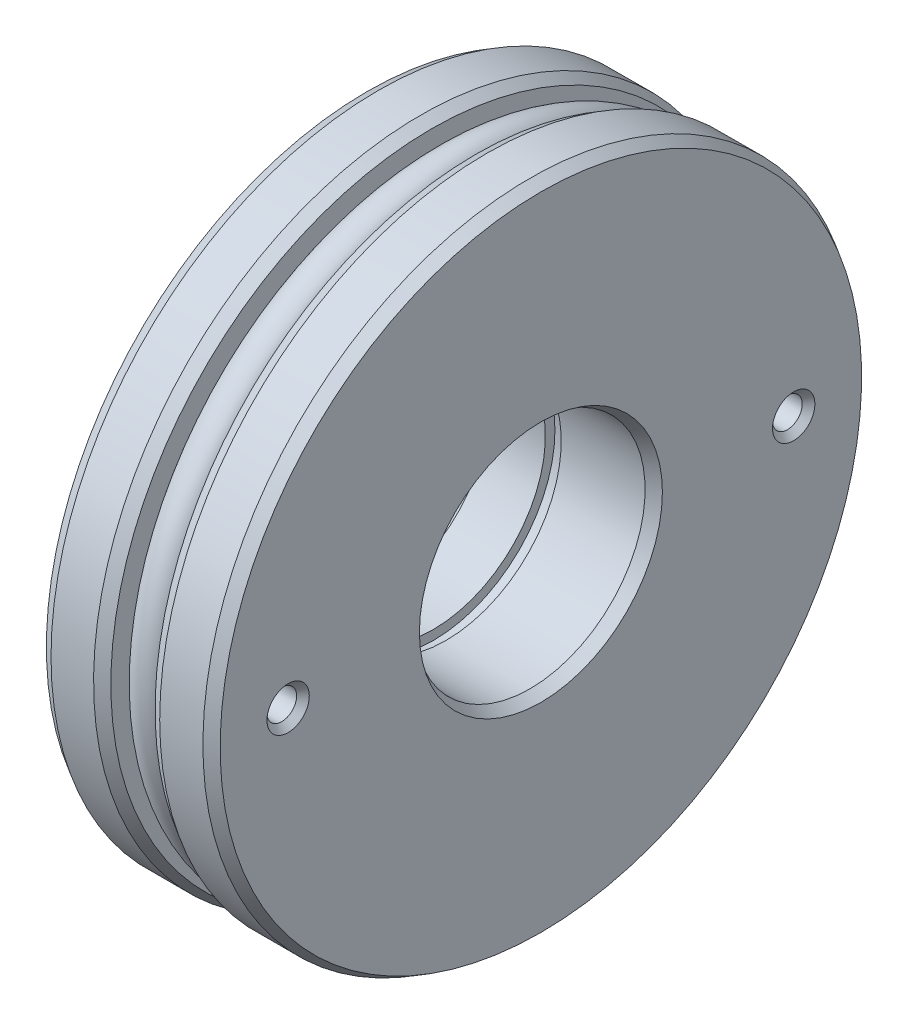
ISO-10303-21;
HEADER;
FILE_DESCRIPTION(('STEP AP214'),'2;1');
FILE_NAME('part.step','',(''),(''),'','','');
FILE_SCHEMA(('AUTOMOTIVE_DESIGN { 1 0 10303 214 1 1 1 1 }'));
ENDSEC;
DATA;
#1=APPLICATION_CONTEXT('core data for automotive mechanical design processes');
#2=APPLICATION_PROTOCOL_DEFINITION('international standard','automotive_design',2000,#1);
#3=PRODUCT_CONTEXT('',#1,'mechanical');
#4=PRODUCT('Part','Part','',(#3));
#5=PRODUCT_RELATED_PRODUCT_CATEGORY('part','',(#4));
#6=PRODUCT_DEFINITION_FORMATION('','',#4);
#7=PRODUCT_DEFINITION_CONTEXT('part definition',#1,'design');
#8=PRODUCT_DEFINITION('design','',#6,#7);
#9=PRODUCT_DEFINITION_SHAPE('','',#8);
#10=(LENGTH_UNIT() NAMED_UNIT(*) SI_UNIT(.MILLI.,.METRE.));
#11=(NAMED_UNIT(*) PLANE_ANGLE_UNIT() SI_UNIT($,.RADIAN.));
#12=(NAMED_UNIT(*) SI_UNIT($,.STERADIAN.) SOLID_ANGLE_UNIT());
#13=UNCERTAINTY_MEASURE_WITH_UNIT(LENGTH_MEASURE(1.E-05),#10,'distance_accuracy_value','');
#14=(GEOMETRIC_REPRESENTATION_CONTEXT(3) GLOBAL_UNCERTAINTY_ASSIGNED_CONTEXT((#13)) GLOBAL_UNIT_ASSIGNED_CONTEXT((#10,
#11,#12)) REPRESENTATION_CONTEXT('',''));
#15=CARTESIAN_POINT('',(0.,0.,0.));
#16=DIRECTION('',(0.,0.,1.));
#17=DIRECTION('',(1.,0.,0.));
#18=AXIS2_PLACEMENT_3D('',#15,#16,#17);
#19=CARTESIAN_POINT('',(3.4925,4.62915,0.));
#20=DIRECTION('',(-1.,0.,0.));
#21=DIRECTION('',(0.,-1.,0.));
#22=AXIS2_PLACEMENT_3D('',#19,#20,#21);
#23=PLANE('',#22);
#24=CARTESIAN_POINT('',(3.4925,0.,-10.16));
#25=DIRECTION('',(-1.,0.,0.));
#26=DIRECTION('',(0.,-1.,0.));
#27=AXIS2_PLACEMENT_3D('',#24,#25,#26);
#28=CIRCLE('',#27,0.850900000000013);
#29=CARTESIAN_POINT('',(3.4925,-0.850900000000013,-10.16));
#30=VERTEX_POINT('',#29);
#31=EDGE_CURVE('P0_E43',#30,#30,#28,.T.);
#32=ORIENTED_EDGE('',*,*,#31,.T.);
#33=EDGE_LOOP('',(#32));
#34=FACE_BOUND('',#33,.T.);
#35=CARTESIAN_POINT('',(3.4925,0.,10.16));
#36=DIRECTION('',(-1.,0.,0.));
#37=DIRECTION('',(0.,-1.,0.));
#38=AXIS2_PLACEMENT_3D('',#35,#36,#37);
#39=CIRCLE('',#38,0.850900000000013);
#40=CARTESIAN_POINT('',(3.4925,-0.850900000000013,10.16));
#41=VERTEX_POINT('',#40);
#42=EDGE_CURVE('P0_E46',#41,#41,#39,.T.);
#43=ORIENTED_EDGE('',*,*,#42,.T.);
#44=EDGE_LOOP('',(#43));
#45=FACE_BOUND('',#44,.T.);
#46=CARTESIAN_POINT('',(3.4925,0.,0.));
#47=DIRECTION('',(-1.,0.,0.));
#48=DIRECTION('',(0.,-1.,0.));
#49=AXIS2_PLACEMENT_3D('',#46,#47,#48);
#50=CIRCLE('',#49,4.88315);
#51=CARTESIAN_POINT('',(3.4925,-4.88315,0.));
#52=VERTEX_POINT('',#51);
#53=EDGE_CURVE('P0_E70',#52,#52,#50,.T.);
#54=ORIENTED_EDGE('',*,*,#53,.T.);
#55=EDGE_LOOP('',(#54));
#56=FACE_BOUND('',#55,.T.);
#57=CARTESIAN_POINT('',(3.4925,0.,0.));
#58=DIRECTION('',(-1.,0.,0.));
#59=DIRECTION('',(0.,-1.,0.));
#60=AXIS2_PLACEMENT_3D('',#57,#58,#59);
#61=CIRCLE('',#60,12.8905);
#62=CARTESIAN_POINT('',(3.4925,-12.8905,0.));
#63=VERTEX_POINT('',#62);
#64=EDGE_CURVE('P0_E73',#63,#63,#61,.F.);
#65=ORIENTED_EDGE('',*,*,#64,.T.);
#66=EDGE_LOOP('',(#65));
#67=FACE_BOUND('',#66,.T.);
#68=ADVANCED_FACE('P0_F17',(#34,#45,#56,#67),#23,.F.);
#69=CARTESIAN_POINT('',(-3.4925,13.1445,0.));
#70=DIRECTION('',(1.,0.,0.));
#71=DIRECTION('',(0.,1.,0.));
#72=AXIS2_PLACEMENT_3D('',#69,#70,#71);
#73=PLANE('',#72);
#74=CARTESIAN_POINT('',(-3.4925,0.,10.16));
#75=DIRECTION('',(1.,0.,0.));
#76=DIRECTION('',(0.,1.,0.));
#77=AXIS2_PLACEMENT_3D('',#74,#75,#76);
#78=CIRCLE('',#77,0.850900000000009);
#79=CARTESIAN_POINT('',(-3.4925,0.850900000000008,10.16));
#80=VERTEX_POINT('',#79);
#81=EDGE_CURVE('P0_E24',#80,#80,#78,.T.);
#82=ORIENTED_EDGE('',*,*,#81,.T.);
#83=EDGE_LOOP('',(#82));
#84=FACE_BOUND('',#83,.T.);
#85=CARTESIAN_POINT('',(-3.4925,0.,-10.16));
#86=DIRECTION('',(1.,0.,0.));
#87=DIRECTION('',(0.,1.,0.));
#88=AXIS2_PLACEMENT_3D('',#85,#86,#87);
#89=CIRCLE('',#88,0.850900000000009);
#90=CARTESIAN_POINT('',(-3.4925,0.850900000000008,-10.16));
#91=VERTEX_POINT('',#90);
#92=EDGE_CURVE('P0_E28',#91,#91,#89,.T.);
#93=ORIENTED_EDGE('',*,*,#92,.T.);
#94=EDGE_LOOP('',(#93));
#95=FACE_BOUND('',#94,.T.);
#96=CARTESIAN_POINT('',(-3.4925,0.,0.));
#97=DIRECTION('',(1.,0.,0.));
#98=DIRECTION('',(0.,1.,0.));
#99=AXIS2_PLACEMENT_3D('',#96,#97,#98);
#100=CIRCLE('',#99,4.75400000000001);
#101=CARTESIAN_POINT('',(-3.4925,4.75400000000001,0.));
#102=VERTEX_POINT('',#101);
#103=EDGE_CURVE('P0_E58',#102,#102,#100,.T.);
#104=ORIENTED_EDGE('',*,*,#103,.T.);
#105=EDGE_LOOP('',(#104));
#106=FACE_BOUND('',#105,.T.);
#107=CARTESIAN_POINT('',(-3.4925,0.,0.));
#108=DIRECTION('',(1.,0.,0.));
#109=DIRECTION('',(0.,1.,0.));
#110=AXIS2_PLACEMENT_3D('',#107,#108,#109);
#111=CIRCLE('',#110,12.8905);
#112=CARTESIAN_POINT('',(-3.4925,12.8905,0.));
#113=VERTEX_POINT('',#112);
#114=EDGE_CURVE('P0_E61',#113,#113,#111,.F.);
#115=ORIENTED_EDGE('',*,*,#114,.T.);
#116=EDGE_LOOP('',(#115));
#117=FACE_BOUND('',#116,.T.);
#118=ADVANCED_FACE('P0_F135',(#84,#95,#106,#117),#73,.F.);
#119=CARTESIAN_POINT('',(-3.4925,0.,0.));
#120=DIRECTION('',(-1.,0.,0.));
#121=DIRECTION('',(0.,-1.,0.));
#122=AXIS2_PLACEMENT_3D('',#119,#120,#121);
#123=CYLINDRICAL_SURFACE('',#122,4.5);
#124=CARTESIAN_POINT('',(-3.05255909487748,0.,0.));
#125=DIRECTION('',(1.,0.,0.));
#126=DIRECTION('',(0.,1.,0.));
#127=AXIS2_PLACEMENT_3D('',#124,#125,#126);
#128=CIRCLE('',#127,4.5);
#129=CARTESIAN_POINT('',(-3.05255909487748,4.5,0.));
#130=VERTEX_POINT('',#129);
#131=EDGE_CURVE('P0_E64',#130,#130,#128,.F.);
#132=ORIENTED_EDGE('',*,*,#131,.T.);
#133=EDGE_LOOP('',(#132));
#134=FACE_BOUND('',#133,.T.);
#135=CARTESIAN_POINT('',(-0.825499999999996,0.,0.));
#136=DIRECTION('',(-1.,0.,0.));
#137=DIRECTION('',(0.,-1.,0.));
#138=AXIS2_PLACEMENT_3D('',#135,#136,#137);
#139=CIRCLE('',#138,4.5);
#140=CARTESIAN_POINT('',(-0.825499999999995,-4.5,0.));
#141=VERTEX_POINT('',#140);
#142=EDGE_CURVE('P0_E85',#141,#141,#139,.T.);
#143=ORIENTED_EDGE('',*,*,#142,.F.);
#144=EDGE_LOOP('',(#143));
#145=FACE_BOUND('',#144,.T.);
#146=ADVANCED_FACE('P0_F143',(#134,#145),#123,.F.);
#147=CARTESIAN_POINT('',(-0.825499999999997,4.5,0.));
#148=DIRECTION('',(-1.,0.,0.));
#149=DIRECTION('',(0.,-1.,0.));
#150=AXIS2_PLACEMENT_3D('',#147,#148,#149);
#151=PLANE('',#150);
#152=CARTESIAN_POINT('',(-0.825499999999996,0.,0.));
#153=DIRECTION('',(-1.,0.,0.));
#154=DIRECTION('',(0.,-1.,0.));
#155=AXIS2_PLACEMENT_3D('',#152,#153,#154);
#156=CIRCLE('',#155,4.88315);
#157=CARTESIAN_POINT('',(-0.825499999999995,-4.88315,0.));
#158=VERTEX_POINT('',#157);
#159=EDGE_CURVE('P0_E88',#158,#158,#156,.T.);
#160=ORIENTED_EDGE('',*,*,#159,.F.);
#161=EDGE_LOOP('',(#160));
#162=FACE_BOUND('',#161,.T.);
#163=ORIENTED_EDGE('',*,*,#142,.T.);
#164=EDGE_LOOP('',(#163));
#165=FACE_BOUND('',#164,.T.);
#166=ADVANCED_FACE('P0_F161',(#162,#165),#151,.F.);
#167=CARTESIAN_POINT('',(-3.4925,0.,0.));
#168=DIRECTION('',(-1.,0.,0.));
#169=DIRECTION('',(0.,-1.,0.));
#170=AXIS2_PLACEMENT_3D('',#167,#168,#169);
#171=CYLINDRICAL_SURFACE('',#170,4.88315);
#172=CARTESIAN_POINT('',(-0.317499999999997,0.,0.));
#173=DIRECTION('',(-1.,0.,0.));
#174=DIRECTION('',(0.,-1.,0.));
#175=AXIS2_PLACEMENT_3D('',#172,#173,#174);
#176=CIRCLE('',#175,4.88315);
#177=CARTESIAN_POINT('',(-0.317499999999996,-4.88315,0.));
#178=VERTEX_POINT('',#177);
#179=EDGE_CURVE('P0_E91',#178,#178,#176,.T.);
#180=ORIENTED_EDGE('',*,*,#179,.F.);
#181=EDGE_LOOP('',(#180));
#182=FACE_BOUND('',#181,.T.);
#183=ORIENTED_EDGE('',*,*,#159,.T.);
#184=EDGE_LOOP('',(#183));
#185=FACE_BOUND('',#184,.T.);
#186=ADVANCED_FACE('P0_F157',(#182,#185),#171,.F.);
#187=CARTESIAN_POINT('',(-0.317499999999997,4.88315,0.));
#188=DIRECTION('',(1.,0.,0.));
#189=DIRECTION('',(0.,1.,0.));
#190=AXIS2_PLACEMENT_3D('',#187,#188,#189);
#191=PLANE('',#190);
#192=CARTESIAN_POINT('',(-0.317499999999997,0.,0.));
#193=DIRECTION('',(-1.,0.,0.));
#194=DIRECTION('',(0.,-1.,0.));
#195=AXIS2_PLACEMENT_3D('',#192,#193,#194);
#196=CIRCLE('',#195,4.62915);
#197=CARTESIAN_POINT('',(-0.317499999999996,-4.62915,0.));
#198=VERTEX_POINT('',#197);
#199=EDGE_CURVE('P0_E94',#198,#198,#196,.T.);
#200=ORIENTED_EDGE('',*,*,#199,.F.);
#201=EDGE_LOOP('',(#200));
#202=FACE_BOUND('',#201,.T.);
#203=ORIENTED_EDGE('',*,*,#179,.T.);
#204=EDGE_LOOP('',(#203));
#205=FACE_BOUND('',#204,.T.);
#206=ADVANCED_FACE('P0_F153',(#202,#205),#191,.F.);
#207=CARTESIAN_POINT('',(-3.4925,0.,0.));
#208=DIRECTION('',(-1.,0.,0.));
#209=DIRECTION('',(0.,-1.,0.));
#210=AXIS2_PLACEMENT_3D('',#207,#208,#209);
#211=CYLINDRICAL_SURFACE('',#210,4.62915);
#212=CARTESIAN_POINT('',(3.0525590948775,0.,0.));
#213=DIRECTION('',(-1.,0.,0.));
#214=DIRECTION('',(0.,-1.,0.));
#215=AXIS2_PLACEMENT_3D('',#212,#213,#214);
#216=CIRCLE('',#215,4.62915);
#217=CARTESIAN_POINT('',(3.0525590948775,-4.62915,0.));
#218=VERTEX_POINT('',#217);
#219=EDGE_CURVE('P0_E67',#218,#218,#216,.F.);
#220=ORIENTED_EDGE('',*,*,#219,.T.);
#221=EDGE_LOOP('',(#220));
#222=FACE_BOUND('',#221,.T.);
#223=ORIENTED_EDGE('',*,*,#199,.T.);
#224=EDGE_LOOP('',(#223));
#225=FACE_BOUND('',#224,.T.);
#226=ADVANCED_FACE('P0_F150',(#222,#225),#211,.F.);
#227=CARTESIAN_POINT('',(-3.4925,0.,0.));
#228=DIRECTION('',(-1.,0.,0.));
#229=DIRECTION('',(0.,-1.,0.));
#230=AXIS2_PLACEMENT_3D('',#227,#228,#229);
#231=CYLINDRICAL_SURFACE('',#230,13.1445);
#232=CARTESIAN_POINT('',(1.31624090512248,0.,0.));
#233=DIRECTION('',(1.,0.,0.));
#234=DIRECTION('',(0.,1.,0.));
#235=AXIS2_PLACEMENT_3D('',#232,#233,#234);
#236=CIRCLE('',#235,13.1445);
#237=CARTESIAN_POINT('',(1.31624090512248,13.1445,0.));
#238=VERTEX_POINT('',#237);
#239=EDGE_CURVE('P0_E76',#238,#238,#236,.T.);
#240=ORIENTED_EDGE('',*,*,#239,.T.);
#241=EDGE_LOOP('',(#240));
#242=FACE_BOUND('',#241,.T.);
#243=CARTESIAN_POINT('',(3.05255909487752,0.,0.));
#244=DIRECTION('',(-1.,0.,0.));
#245=DIRECTION('',(0.,-1.,0.));
#246=AXIS2_PLACEMENT_3D('',#243,#244,#245);
#247=CIRCLE('',#246,13.1445);
#248=CARTESIAN_POINT('',(3.05255909487753,-13.1445,0.));
#249=VERTEX_POINT('',#248);
#250=EDGE_CURVE('P0_E79',#249,#249,#247,.T.);
#251=ORIENTED_EDGE('',*,*,#250,.T.);
#252=EDGE_LOOP('',(#251));
#253=FACE_BOUND('',#252,.T.);
#254=ADVANCED_FACE('P0_F148',(#242,#253),#231,.T.);
#255=CARTESIAN_POINT('',(0.8763,13.1445,0.));
#256=DIRECTION('',(1.,0.,0.));
#257=DIRECTION('',(0.,1.,0.));
#258=AXIS2_PLACEMENT_3D('',#255,#256,#257);
#259=PLANE('',#258);
#260=CARTESIAN_POINT('',(0.876300000000003,0.,0.));
#261=DIRECTION('',(1.,0.,0.));
#262=DIRECTION('',(0.,1.,0.));
#263=AXIS2_PLACEMENT_3D('',#260,#261,#262);
#264=CIRCLE('',#263,12.8905);
#265=CARTESIAN_POINT('',(0.8763,12.8905,0.));
#266=VERTEX_POINT('',#265);
#267=EDGE_CURVE('P0_E82',#266,#266,#264,.F.);
#268=ORIENTED_EDGE('',*,*,#267,.T.);
#269=EDGE_LOOP('',(#268));
#270=FACE_BOUND('',#269,.T.);
#271=CARTESIAN_POINT('',(0.876300000000003,0.,0.));
#272=DIRECTION('',(-1.,0.,0.));
#273=DIRECTION('',(0.,-1.,0.));
#274=AXIS2_PLACEMENT_3D('',#271,#272,#273);
#275=CIRCLE('',#274,11.1379);
#276=CARTESIAN_POINT('',(0.876300000000005,-11.1379,0.));
#277=VERTEX_POINT('',#276);
#278=EDGE_CURVE('P0_E97',#277,#277,#275,.T.);
#279=ORIENTED_EDGE('',*,*,#278,.F.);
#280=EDGE_LOOP('',(#279));
#281=FACE_BOUND('',#280,.T.);
#282=ADVANCED_FACE('P0_F241',(#270,#281),#259,.F.);
#283=CARTESIAN_POINT('',(-3.4925,0.,0.));
#284=DIRECTION('',(-1.,0.,0.));
#285=DIRECTION('',(0.,-1.,0.));
#286=AXIS2_PLACEMENT_3D('',#283,#284,#285);
#287=CYLINDRICAL_SURFACE('',#286,11.1379);
#288=CARTESIAN_POINT('',(-0.901699999999998,0.,0.));
#289=DIRECTION('',(-1.,0.,0.));
#290=DIRECTION('',(0.,-1.,0.));
#291=AXIS2_PLACEMENT_3D('',#288,#289,#290);
#292=CIRCLE('',#291,11.1379);
#293=CARTESIAN_POINT('',(-0.901699999999995,-11.1379,0.));
#294=VERTEX_POINT('',#293);
#295=EDGE_CURVE('P0_E100',#294,#294,#292,.T.);
#296=ORIENTED_EDGE('',*,*,#295,.F.);
#297=EDGE_LOOP('',(#296));
#298=FACE_BOUND('',#297,.T.);
#299=ORIENTED_EDGE('',*,*,#278,.T.);
#300=EDGE_LOOP('',(#299));
#301=FACE_BOUND('',#300,.T.);
#302=ADVANCED_FACE('P0_F238',(#298,#301),#287,.T.);
#303=CARTESIAN_POINT('',(-0.9017,11.1379,0.));
#304=DIRECTION('',(-1.,0.,0.));
#305=DIRECTION('',(0.,-1.,0.));
#306=AXIS2_PLACEMENT_3D('',#303,#304,#305);
#307=PLANE('',#306);
#308=CARTESIAN_POINT('',(-0.901699999999998,0.,0.));
#309=DIRECTION('',(-1.,0.,0.));
#310=DIRECTION('',(0.,-1.,0.));
#311=AXIS2_PLACEMENT_3D('',#308,#309,#310);
#312=CIRCLE('',#311,12.8905);
#313=CARTESIAN_POINT('',(-0.901699999999995,-12.8905,0.));
#314=VERTEX_POINT('',#313);
#315=EDGE_CURVE('P0_E49',#314,#314,#312,.F.);
#316=ORIENTED_EDGE('',*,*,#315,.T.);
#317=EDGE_LOOP('',(#316));
#318=FACE_BOUND('',#317,.T.);
#319=ORIENTED_EDGE('',*,*,#295,.T.);
#320=EDGE_LOOP('',(#319));
#321=FACE_BOUND('',#320,.T.);
#322=ADVANCED_FACE('P0_F234',(#318,#321),#307,.F.);
#323=CARTESIAN_POINT('',(-3.4925,0.,0.));
#324=DIRECTION('',(-1.,0.,0.));
#325=DIRECTION('',(0.,-1.,0.));
#326=AXIS2_PLACEMENT_3D('',#323,#324,#325);
#327=CYLINDRICAL_SURFACE('',#326,13.1445);
#328=CARTESIAN_POINT('',(-1.34164090512249,0.,0.));
#329=DIRECTION('',(-1.,0.,0.));
#330=DIRECTION('',(0.,-1.,0.));
#331=AXIS2_PLACEMENT_3D('',#328,#329,#330);
#332=CIRCLE('',#331,13.1445);
#333=CARTESIAN_POINT('',(-1.34164090512249,-13.1445,0.));
#334=VERTEX_POINT('',#333);
#335=EDGE_CURVE('P0_E52',#334,#334,#332,.T.);
#336=ORIENTED_EDGE('',*,*,#335,.T.);
#337=EDGE_LOOP('',(#336));
#338=FACE_BOUND('',#337,.T.);
#339=CARTESIAN_POINT('',(-3.05255909487751,0.,0.));
#340=DIRECTION('',(1.,0.,0.));
#341=DIRECTION('',(0.,1.,0.));
#342=AXIS2_PLACEMENT_3D('',#339,#340,#341);
#343=CIRCLE('',#342,13.1445);
#344=CARTESIAN_POINT('',(-3.05255909487752,13.1445,0.));
#345=VERTEX_POINT('',#344);
#346=EDGE_CURVE('P0_E55',#345,#345,#343,.T.);
#347=ORIENTED_EDGE('',*,*,#346,.T.);
#348=EDGE_LOOP('',(#347));
#349=FACE_BOUND('',#348,.T.);
#350=ADVANCED_FACE('P0_F173',(#338,#349),#327,.T.);
#351=CARTESIAN_POINT('',(0.876300000000003,0.,0.));
#352=DIRECTION('',(1.,0.,0.));
#353=DIRECTION('',(0.,1.,0.));
#354=AXIS2_PLACEMENT_3D('',#351,#352,#353);
#355=CONICAL_SURFACE('',#354,12.8905,0.523598775598293);
#356=ORIENTED_EDGE('',*,*,#239,.F.);
#357=EDGE_LOOP('',(#356));
#358=FACE_BOUND('',#357,.T.);
#359=ORIENTED_EDGE('',*,*,#267,.F.);
#360=EDGE_LOOP('',(#359));
#361=FACE_BOUND('',#360,.T.);
#362=ADVANCED_FACE('P0_F169',(#358,#361),#355,.T.);
#363=CARTESIAN_POINT('',(3.4925,0.,0.));
#364=DIRECTION('',(1.,0.,0.));
#365=DIRECTION('',(0.,1.,0.));
#366=AXIS2_PLACEMENT_3D('',#363,#364,#365);
#367=CONICAL_SURFACE('',#366,4.88315,0.5235987755983);
#368=ORIENTED_EDGE('',*,*,#219,.F.);
#369=EDGE_LOOP('',(#368));
#370=FACE_BOUND('',#369,.T.);
#371=ORIENTED_EDGE('',*,*,#53,.F.);
#372=EDGE_LOOP('',(#371));
#373=FACE_BOUND('',#372,.T.);
#374=ADVANCED_FACE('P0_F172',(#370,#373),#367,.F.);
#375=CARTESIAN_POINT('',(-3.05255909487748,0.,0.));
#376=DIRECTION('',(-1.,0.,0.));
#377=DIRECTION('',(0.,-1.,0.));
#378=AXIS2_PLACEMENT_3D('',#375,#376,#377);
#379=CONICAL_SURFACE('',#378,4.5,0.523598775598301);
#380=ORIENTED_EDGE('',*,*,#103,.F.);
#381=EDGE_LOOP('',(#380));
#382=FACE_BOUND('',#381,.T.);
#383=ORIENTED_EDGE('',*,*,#131,.F.);
#384=EDGE_LOOP('',(#383));
#385=FACE_BOUND('',#384,.T.);
#386=ADVANCED_FACE('P0_F177',(#382,#385),#379,.F.);
#387=CARTESIAN_POINT('',(3.05255909487752,0.,0.));
#388=DIRECTION('',(-1.,0.,0.));
#389=DIRECTION('',(0.,-1.,0.));
#390=AXIS2_PLACEMENT_3D('',#387,#388,#389);
#391=CONICAL_SURFACE('',#390,13.1445,0.523598775598297);
#392=ORIENTED_EDGE('',*,*,#64,.F.);
#393=EDGE_LOOP('',(#392));
#394=FACE_BOUND('',#393,.T.);
#395=ORIENTED_EDGE('',*,*,#250,.F.);
#396=EDGE_LOOP('',(#395));
#397=FACE_BOUND('',#396,.T.);
#398=ADVANCED_FACE('P0_F181',(#394,#397),#391,.T.);
#399=CARTESIAN_POINT('',(-1.34164090512249,0.,0.));
#400=DIRECTION('',(-1.,0.,0.));
#401=DIRECTION('',(0.,-1.,0.));
#402=AXIS2_PLACEMENT_3D('',#399,#400,#401);
#403=CONICAL_SURFACE('',#402,13.1445,0.523598775598305);
#404=ORIENTED_EDGE('',*,*,#315,.F.);
#405=EDGE_LOOP('',(#404));
#406=FACE_BOUND('',#405,.T.);
#407=ORIENTED_EDGE('',*,*,#335,.F.);
#408=EDGE_LOOP('',(#407));
#409=FACE_BOUND('',#408,.T.);
#410=ADVANCED_FACE('P0_F185',(#406,#409),#403,.T.);
#411=CARTESIAN_POINT('',(-3.4925,0.,0.));
#412=DIRECTION('',(1.,0.,0.));
#413=DIRECTION('',(0.,1.,0.));
#414=AXIS2_PLACEMENT_3D('',#411,#412,#413);
#415=CONICAL_SURFACE('',#414,12.8905,0.523598775598299);
#416=ORIENTED_EDGE('',*,*,#346,.F.);
#417=EDGE_LOOP('',(#416));
#418=FACE_BOUND('',#417,.T.);
#419=ORIENTED_EDGE('',*,*,#114,.F.);
#420=EDGE_LOOP('',(#419));
#421=FACE_BOUND('',#420,.T.);
#422=ADVANCED_FACE('P0_F189',(#418,#421),#415,.T.);
#423=CARTESIAN_POINT('',(-0.952499999999997,0.,-10.16));
#424=DIRECTION('',(-1.,0.,0.));
#425=DIRECTION('',(0.,-1.,0.));
#426=AXIS2_PLACEMENT_3D('',#423,#424,#425);
#427=CYLINDRICAL_SURFACE('',#426,0.596900000000001);
#428=CARTESIAN_POINT('',(-3.23849999999999,0.,-10.16));
#429=DIRECTION('',(1.,0.,0.));
#430=DIRECTION('',(0.,1.,0.));
#431=AXIS2_PLACEMENT_3D('',#428,#429,#430);
#432=CIRCLE('',#431,0.596900000000001);
#433=CARTESIAN_POINT('',(-3.23849999999999,0.596900000000001,-10.16));
#434=VERTEX_POINT('',#433);
#435=EDGE_CURVE('P0_E10',#434,#434,#432,.F.);
#436=ORIENTED_EDGE('',*,*,#435,.T.);
#437=EDGE_LOOP('',(#436));
#438=FACE_BOUND('',#437,.T.);
#439=CARTESIAN_POINT('',(-0.952499999999997,0.,-10.16));
#440=DIRECTION('',(-1.,0.,0.));
#441=DIRECTION('',(0.,-1.,0.));
#442=AXIS2_PLACEMENT_3D('',#439,#440,#441);
#443=CIRCLE('',#442,0.596900000000001);
#444=CARTESIAN_POINT('',(-0.952499999999997,-0.596900000000002,-10.16));
#445=VERTEX_POINT('',#444);
#446=EDGE_CURVE('P0_E103',#445,#445,#443,.T.);
#447=ORIENTED_EDGE('',*,*,#446,.F.);
#448=EDGE_LOOP('',(#447));
#449=FACE_BOUND('',#448,.T.);
#450=ADVANCED_FACE('P0_F192',(#438,#449),#427,.F.);
#451=CARTESIAN_POINT('',(-0.952499999999997,0.,-10.16));
#452=DIRECTION('',(-1.,0.,0.));
#453=DIRECTION('',(0.,-1.,0.));
#454=AXIS2_PLACEMENT_3D('',#451,#452,#453);
#455=PLANE('',#454);
#456=ORIENTED_EDGE('',*,*,#446,.T.);
#457=EDGE_LOOP('',(#456));
#458=FACE_BOUND('',#457,.T.);
#459=ADVANCED_FACE('P0_F212',(#458),#455,.T.);
#460=CARTESIAN_POINT('',(-0.952499999999997,0.,10.16));
#461=DIRECTION('',(-1.,0.,0.));
#462=DIRECTION('',(0.,-1.,0.));
#463=AXIS2_PLACEMENT_3D('',#460,#461,#462);
#464=CYLINDRICAL_SURFACE('',#463,0.596900000000001);
#465=CARTESIAN_POINT('',(-3.23849999999999,0.,10.16));
#466=DIRECTION('',(1.,0.,0.));
#467=DIRECTION('',(0.,1.,0.));
#468=AXIS2_PLACEMENT_3D('',#465,#466,#467);
#469=CIRCLE('',#468,0.596900000000001);
#470=CARTESIAN_POINT('',(-3.23849999999999,0.596900000000001,10.16));
#471=VERTEX_POINT('',#470);
#472=EDGE_CURVE('P0_E32',#471,#471,#469,.F.);
#473=ORIENTED_EDGE('',*,*,#472,.T.);
#474=EDGE_LOOP('',(#473));
#475=FACE_BOUND('',#474,.T.);
#476=CARTESIAN_POINT('',(-0.952499999999997,0.,10.16));
#477=DIRECTION('',(-1.,0.,0.));
#478=DIRECTION('',(0.,-1.,0.));
#479=AXIS2_PLACEMENT_3D('',#476,#477,#478);
#480=CIRCLE('',#479,0.596900000000001);
#481=CARTESIAN_POINT('',(-0.952499999999997,-0.596900000000002,10.16));
#482=VERTEX_POINT('',#481);
#483=EDGE_CURVE('P0_E106',#482,#482,#480,.T.);
#484=ORIENTED_EDGE('',*,*,#483,.F.);
#485=EDGE_LOOP('',(#484));
#486=FACE_BOUND('',#485,.T.);
#487=ADVANCED_FACE('P0_F208',(#475,#486),#464,.F.);
#488=CARTESIAN_POINT('',(-0.952499999999997,0.,10.16));
#489=DIRECTION('',(-1.,0.,0.));
#490=DIRECTION('',(0.,-1.,0.));
#491=AXIS2_PLACEMENT_3D('',#488,#489,#490);
#492=PLANE('',#491);
#493=ORIENTED_EDGE('',*,*,#483,.T.);
#494=EDGE_LOOP('',(#493));
#495=FACE_BOUND('',#494,.T.);
#496=ADVANCED_FACE('P0_F211',(#495),#492,.T.);
#497=CARTESIAN_POINT('',(0.952499999999997,0.,-10.16));
#498=DIRECTION('',(1.,0.,0.));
#499=DIRECTION('',(0.,1.,0.));
#500=AXIS2_PLACEMENT_3D('',#497,#498,#499);
#501=CYLINDRICAL_SURFACE('',#500,0.596900000000001);
#502=CARTESIAN_POINT('',(3.23849999999999,0.,-10.16));
#503=DIRECTION('',(-1.,0.,0.));
#504=DIRECTION('',(0.,-1.,0.));
#505=AXIS2_PLACEMENT_3D('',#502,#503,#504);
#506=CIRCLE('',#505,0.596900000000001);
#507=CARTESIAN_POINT('',(3.23849999999999,-0.596900000000002,-10.16));
#508=VERTEX_POINT('',#507);
#509=EDGE_CURVE('P0_E40',#508,#508,#506,.F.);
#510=ORIENTED_EDGE('',*,*,#509,.T.);
#511=EDGE_LOOP('',(#510));
#512=FACE_BOUND('',#511,.T.);
#513=CARTESIAN_POINT('',(0.952499999999997,0.,-10.16));
#514=DIRECTION('',(-1.,0.,0.));
#515=DIRECTION('',(0.,-1.,0.));
#516=AXIS2_PLACEMENT_3D('',#513,#514,#515);
#517=CIRCLE('',#516,0.596900000000001);
#518=CARTESIAN_POINT('',(0.952499999999997,-0.596900000000002,-10.16));
#519=VERTEX_POINT('',#518);
#520=EDGE_CURVE('P0_E109',#519,#519,#517,.T.);
#521=ORIENTED_EDGE('',*,*,#520,.T.);
#522=EDGE_LOOP('',(#521));
#523=FACE_BOUND('',#522,.T.);
#524=ADVANCED_FACE('P0_F217',(#512,#523),#501,.F.);
#525=CARTESIAN_POINT('',(0.952499999999997,0.,-10.16));
#526=DIRECTION('',(1.,0.,0.));
#527=DIRECTION('',(0.,-1.,0.));
#528=AXIS2_PLACEMENT_3D('',#525,#526,#527);
#529=PLANE('',#528);
#530=ORIENTED_EDGE('',*,*,#520,.F.);
#531=EDGE_LOOP('',(#530));
#532=FACE_BOUND('',#531,.T.);
#533=ADVANCED_FACE('P0_F131',(#532),#529,.T.);
#534=CARTESIAN_POINT('',(0.952499999999997,0.,10.16));
#535=DIRECTION('',(1.,0.,0.));
#536=DIRECTION('',(0.,1.,0.));
#537=AXIS2_PLACEMENT_3D('',#534,#535,#536);
#538=CYLINDRICAL_SURFACE('',#537,0.596900000000001);
#539=CARTESIAN_POINT('',(3.23849999999999,0.,10.16));
#540=DIRECTION('',(-1.,0.,0.));
#541=DIRECTION('',(0.,-1.,0.));
#542=AXIS2_PLACEMENT_3D('',#539,#540,#541);
#543=CIRCLE('',#542,0.596900000000001);
#544=CARTESIAN_POINT('',(3.23849999999999,-0.596900000000002,10.16));
#545=VERTEX_POINT('',#544);
#546=EDGE_CURVE('P0_E37',#545,#545,#543,.F.);
#547=ORIENTED_EDGE('',*,*,#546,.T.);
#548=EDGE_LOOP('',(#547));
#549=FACE_BOUND('',#548,.T.);
#550=CARTESIAN_POINT('',(0.952499999999997,0.,10.16));
#551=DIRECTION('',(-1.,0.,0.));
#552=DIRECTION('',(0.,-1.,0.));
#553=AXIS2_PLACEMENT_3D('',#550,#551,#552);
#554=CIRCLE('',#553,0.596900000000001);
#555=CARTESIAN_POINT('',(0.952499999999997,-0.596900000000002,10.16));
#556=VERTEX_POINT('',#555);
#557=EDGE_CURVE('P0_E112',#556,#556,#554,.T.);
#558=ORIENTED_EDGE('',*,*,#557,.T.);
#559=EDGE_LOOP('',(#558));
#560=FACE_BOUND('',#559,.T.);
#561=ADVANCED_FACE('P0_F116',(#549,#560),#538,.F.);
#562=CARTESIAN_POINT('',(0.952499999999997,0.,10.16));
#563=DIRECTION('',(1.,0.,0.));
#564=DIRECTION('',(0.,-1.,0.));
#565=AXIS2_PLACEMENT_3D('',#562,#563,#564);
#566=PLANE('',#565);
#567=ORIENTED_EDGE('',*,*,#557,.F.);
#568=EDGE_LOOP('',(#567));
#569=FACE_BOUND('',#568,.T.);
#570=ADVANCED_FACE('P0_F118',(#569),#566,.T.);
#571=CARTESIAN_POINT('',(3.4925,0.,-10.16));
#572=DIRECTION('',(1.,0.,0.));
#573=DIRECTION('',(0.,1.,0.));
#574=AXIS2_PLACEMENT_3D('',#571,#572,#573);
#575=CONICAL_SURFACE('',#574,0.850900000000012,0.785398163397439);
#576=ORIENTED_EDGE('',*,*,#509,.F.);
#577=EDGE_LOOP('',(#576));
#578=FACE_BOUND('',#577,.T.);
#579=ORIENTED_EDGE('',*,*,#31,.F.);
#580=EDGE_LOOP('',(#579));
#581=FACE_BOUND('',#580,.T.);
#582=ADVANCED_FACE('P0_F120',(#578,#581),#575,.F.);
#583=CARTESIAN_POINT('',(3.4925,0.,10.16));
#584=DIRECTION('',(1.,0.,0.));
#585=DIRECTION('',(0.,1.,0.));
#586=AXIS2_PLACEMENT_3D('',#583,#584,#585);
#587=CONICAL_SURFACE('',#586,0.850900000000012,0.785398163397439);
#588=ORIENTED_EDGE('',*,*,#546,.F.);
#589=EDGE_LOOP('',(#588));
#590=FACE_BOUND('',#589,.T.);
#591=ORIENTED_EDGE('',*,*,#42,.F.);
#592=EDGE_LOOP('',(#591));
#593=FACE_BOUND('',#592,.T.);
#594=ADVANCED_FACE('P0_F128',(#590,#593),#587,.F.);
#595=CARTESIAN_POINT('',(-3.23849999999999,0.,10.16));
#596=DIRECTION('',(-1.,0.,0.));
#597=DIRECTION('',(0.,-1.,0.));
#598=AXIS2_PLACEMENT_3D('',#595,#596,#597);
#599=CONICAL_SURFACE('',#598,0.596900000000001,0.785398163397451);
#600=ORIENTED_EDGE('',*,*,#81,.F.);
#601=EDGE_LOOP('',(#600));
#602=FACE_BOUND('',#601,.T.);
#603=ORIENTED_EDGE('',*,*,#472,.F.);
#604=EDGE_LOOP('',(#603));
#605=FACE_BOUND('',#604,.T.);
#606=ADVANCED_FACE('P0_F196',(#602,#605),#599,.F.);
#607=CARTESIAN_POINT('',(-3.23849999999999,0.,-10.16));
#608=DIRECTION('',(-1.,0.,0.));
#609=DIRECTION('',(0.,-1.,0.));
#610=AXIS2_PLACEMENT_3D('',#607,#608,#609);
#611=CONICAL_SURFACE('',#610,0.596900000000001,0.785398163397451);
#612=ORIENTED_EDGE('',*,*,#92,.F.);
#613=EDGE_LOOP('',(#612));
#614=FACE_BOUND('',#613,.T.);
#615=ORIENTED_EDGE('',*,*,#435,.F.);
#616=EDGE_LOOP('',(#615));
#617=FACE_BOUND('',#616,.T.);
#618=ADVANCED_FACE('P0_F19',(#614,#617),#611,.F.);
#619=CLOSED_SHELL('',(#68,#118,#146,#166,#186,#206,#226,#254,#282,#302,#322,#350,#362,#374,#386,
#398,#410,#422,#450,#459,#487,#496,#524,#533,#561,#570,#582,#594,#606,#618));
#620=MANIFOLD_SOLID_BREP('P0_B1',#619);
#621=CARTESIAN_POINT('',(0.,0.,0.));
#622=DIRECTION('',(-1.,0.,0.));
#623=DIRECTION('',(0.,0.0932032646395384,-0.995647101869198));
#624=AXIS2_PLACEMENT_3D('',#621,#622,#623);
#625=TOROIDAL_SURFACE('',#624,11.93165,0.793750000000001);
#626=CARTESIAN_POINT('',(0.,1.18604882384398,-12.6700076301263));
#627=VERTEX_POINT('',#626);
#628=VERTEX_LOOP('',#627);
#629=FACE_BOUND('',#628,.T.);
#630=ADVANCED_FACE('P1_F15',(#629),#625,.T.);
#631=CLOSED_SHELL('',(#630));
#632=MANIFOLD_SOLID_BREP('P1_B1',#631);
#633=ADVANCED_BREP_SHAPE_REPRESENTATION('',(#18,#620,#632),#14);
#634=SHAPE_DEFINITION_REPRESENTATION(#9,#633);
ENDSEC;
END-ISO-10303-21;
